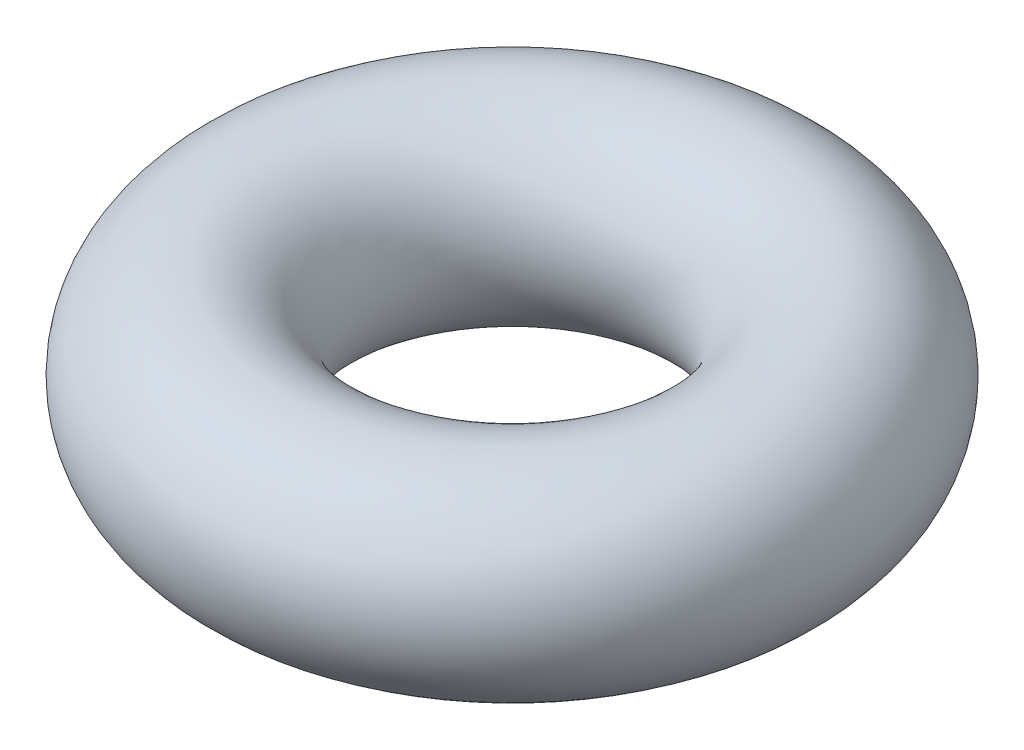
ISO-10303-21;
HEADER;
FILE_DESCRIPTION(('STEP AP214'),'2;1');
FILE_NAME('part.step','',(''),(''),'','','');
FILE_SCHEMA(('AUTOMOTIVE_DESIGN { 1 0 10303 214 1 1 1 1 }'));
ENDSEC;
DATA;
#1=APPLICATION_CONTEXT('core data for automotive mechanical design processes');
#2=APPLICATION_PROTOCOL_DEFINITION('international standard','automotive_design',2000,#1);
#3=PRODUCT_CONTEXT('',#1,'mechanical');
#4=PRODUCT('Part','Part','',(#3));
#5=PRODUCT_RELATED_PRODUCT_CATEGORY('part','',(#4));
#6=PRODUCT_DEFINITION_FORMATION('','',#4);
#7=PRODUCT_DEFINITION_CONTEXT('part definition',#1,'design');
#8=PRODUCT_DEFINITION('design','',#6,#7);
#9=PRODUCT_DEFINITION_SHAPE('','',#8);
#10=(LENGTH_UNIT() NAMED_UNIT(*) SI_UNIT(.MILLI.,.METRE.));
#11=(NAMED_UNIT(*) PLANE_ANGLE_UNIT() SI_UNIT($,.RADIAN.));
#12=(NAMED_UNIT(*) SI_UNIT($,.STERADIAN.) SOLID_ANGLE_UNIT());
#13=UNCERTAINTY_MEASURE_WITH_UNIT(LENGTH_MEASURE(1.E-05),#10,'distance_accuracy_value','');
#14=(GEOMETRIC_REPRESENTATION_CONTEXT(3) GLOBAL_UNCERTAINTY_ASSIGNED_CONTEXT((#13)) GLOBAL_UNIT_ASSIGNED_CONTEXT((#10,
#11,#12)) REPRESENTATION_CONTEXT('',''));
#15=CARTESIAN_POINT('',(0.,0.,0.));
#16=DIRECTION('',(0.,0.,1.));
#17=DIRECTION('',(1.,0.,0.));
#18=AXIS2_PLACEMENT_3D('',#15,#16,#17);
#19=CARTESIAN_POINT('',(0.,0.,0.));
#20=DIRECTION('',(0.,1.,0.));
#21=DIRECTION('',(-1.,0.,0.));
#22=AXIS2_PLACEMENT_3D('',#19,#20,#21);
#23=TOROIDAL_SURFACE('',#22,1.75,0.750000000000001);
#24=CARTESIAN_POINT('',(-2.5,0.,0.));
#25=VERTEX_POINT('',#24);
#26=VERTEX_LOOP('',#25);
#27=FACE_BOUND('',#26,.T.);
#28=ADVANCED_FACE('F29',(#27),#23,.T.);
#29=CLOSED_SHELL('',(#28));
#30=MANIFOLD_SOLID_BREP('B2',#29);
#31=ADVANCED_BREP_SHAPE_REPRESENTATION('',(#18,#30),#14);
#32=SHAPE_DEFINITION_REPRESENTATION(#9,#31);
ENDSEC;
END-ISO-10303-21;
